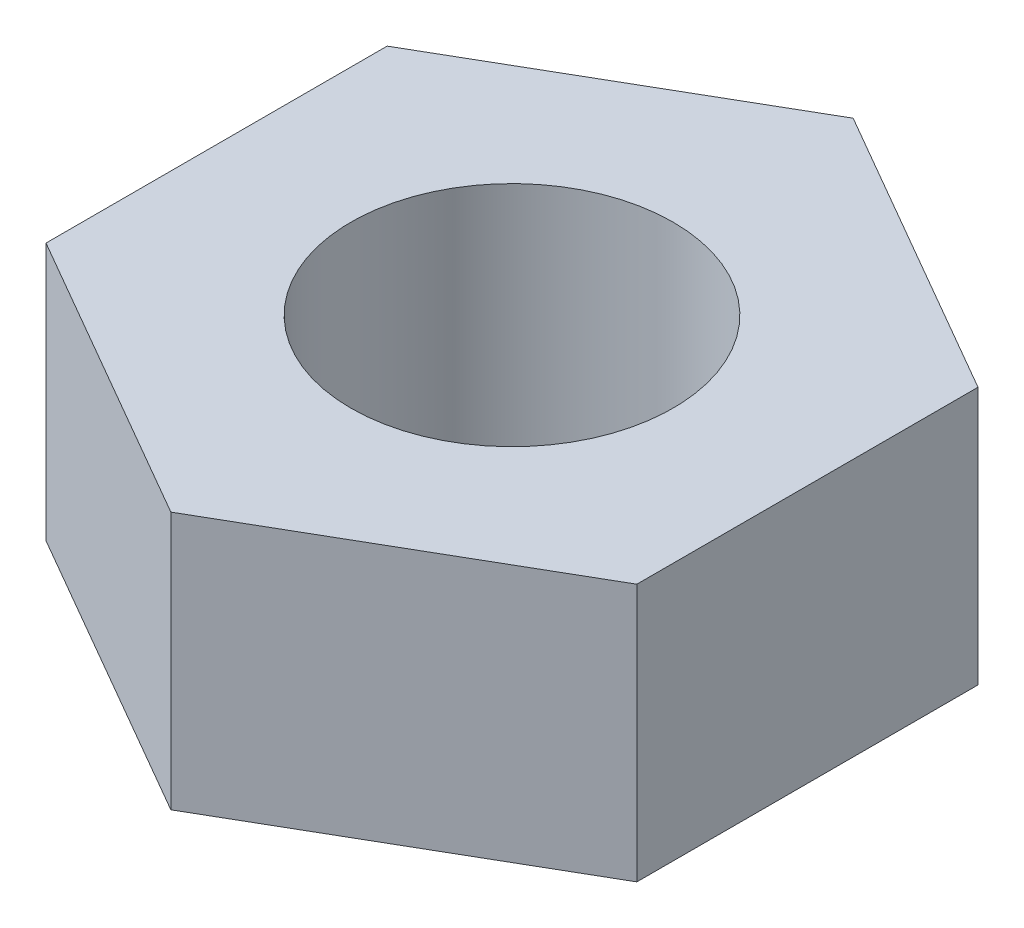
ISO-10303-21;
HEADER;
FILE_DESCRIPTION(('STEP AP214'),'2;1');
FILE_NAME('part.step','',(''),(''),'','','');
FILE_SCHEMA(('AUTOMOTIVE_DESIGN { 1 0 10303 214 1 1 1 1 }'));
ENDSEC;
DATA;
#1=APPLICATION_CONTEXT('core data for automotive mechanical design processes');
#2=APPLICATION_PROTOCOL_DEFINITION('international standard','automotive_design',2000,#1);
#3=PRODUCT_CONTEXT('',#1,'mechanical');
#4=PRODUCT('Part','Part','',(#3));
#5=PRODUCT_RELATED_PRODUCT_CATEGORY('part','',(#4));
#6=PRODUCT_DEFINITION_FORMATION('','',#4);
#7=PRODUCT_DEFINITION_CONTEXT('part definition',#1,'design');
#8=PRODUCT_DEFINITION('design','',#6,#7);
#9=PRODUCT_DEFINITION_SHAPE('','',#8);
#10=(LENGTH_UNIT() NAMED_UNIT(*) SI_UNIT(.MILLI.,.METRE.));
#11=(NAMED_UNIT(*) PLANE_ANGLE_UNIT() SI_UNIT($,.RADIAN.));
#12=(NAMED_UNIT(*) SI_UNIT($,.STERADIAN.) SOLID_ANGLE_UNIT());
#13=UNCERTAINTY_MEASURE_WITH_UNIT(LENGTH_MEASURE(1.E-05),#10,'distance_accuracy_value','');
#14=(GEOMETRIC_REPRESENTATION_CONTEXT(3) GLOBAL_UNCERTAINTY_ASSIGNED_CONTEXT((#13)) GLOBAL_UNIT_ASSIGNED_CONTEXT((#10,
#11,#12)) REPRESENTATION_CONTEXT('',''));
#15=CARTESIAN_POINT('',(0.,0.,0.));
#16=DIRECTION('',(0.,0.,1.));
#17=DIRECTION('',(1.,0.,0.));
#18=AXIS2_PLACEMENT_3D('',#15,#16,#17);
#19=CARTESIAN_POINT('',(0.,2.4,0.));
#20=DIRECTION('',(0.,1.,0.));
#21=DIRECTION('',(0.,0.,1.));
#22=AXIS2_PLACEMENT_3D('',#19,#20,#21);
#23=PLANE('',#22);
#24=DIRECTION('',(0.,0.,-1.));
#25=VECTOR('',#24,1.);
#26=CARTESIAN_POINT('',(2.75,2.4,1.58771324027147));
#27=LINE('',#26,#25);
#28=CARTESIAN_POINT('',(2.75,2.4,1.58771324027147));
#29=VERTEX_POINT('',#28);
#30=CARTESIAN_POINT('',(2.75,2.4,-1.58771324027147));
#31=VERTEX_POINT('',#30);
#32=EDGE_CURVE('E137',#29,#31,#27,.T.);
#33=ORIENTED_EDGE('',*,*,#32,.T.);
#34=DIRECTION('',(-0.866025403784439,0.,-0.5));
#35=VECTOR('',#34,1.);
#36=CARTESIAN_POINT('',(2.75,2.4,-1.58771324027147));
#37=LINE('',#36,#35);
#38=CARTESIAN_POINT('',(0.,2.4,-3.17542648054294));
#39=VERTEX_POINT('',#38);
#40=EDGE_CURVE('E95',#31,#39,#37,.T.);
#41=ORIENTED_EDGE('',*,*,#40,.T.);
#42=DIRECTION('',(-0.866025403784439,0.,0.5));
#43=VECTOR('',#42,1.);
#44=CARTESIAN_POINT('',(0.,2.4,-3.17542648054294));
#45=LINE('',#44,#43);
#46=CARTESIAN_POINT('',(-2.75,2.4,-1.58771324027147));
#47=VERTEX_POINT('',#46);
#48=EDGE_CURVE('E108',#39,#47,#45,.T.);
#49=ORIENTED_EDGE('',*,*,#48,.T.);
#50=DIRECTION('',(0.,0.,1.));
#51=VECTOR('',#50,1.);
#52=CARTESIAN_POINT('',(-2.75,2.4,-1.58771324027147));
#53=LINE('',#52,#51);
#54=CARTESIAN_POINT('',(-2.75,2.4,1.58771324027147));
#55=VERTEX_POINT('',#54);
#56=EDGE_CURVE('E102',#47,#55,#53,.T.);
#57=ORIENTED_EDGE('',*,*,#56,.T.);
#58=DIRECTION('',(0.866025403784439,0.,0.5));
#59=VECTOR('',#58,1.);
#60=CARTESIAN_POINT('',(-2.75,2.4,1.58771324027147));
#61=LINE('',#60,#59);
#62=CARTESIAN_POINT('',(0.,2.4,3.17542648054294));
#63=VERTEX_POINT('',#62);
#64=EDGE_CURVE('E106',#55,#63,#61,.T.);
#65=ORIENTED_EDGE('',*,*,#64,.T.);
#66=DIRECTION('',(0.866025403784439,0.,-0.5));
#67=VECTOR('',#66,1.);
#68=CARTESIAN_POINT('',(0.,2.4,3.17542648054294));
#69=LINE('',#68,#67);
#70=EDGE_CURVE('E58',#63,#29,#69,.T.);
#71=ORIENTED_EDGE('',*,*,#70,.T.);
#72=EDGE_LOOP('',(#33,#41,#49,#57,#65,#71));
#73=FACE_BOUND('',#72,.T.);
#74=CARTESIAN_POINT('',(0.,2.4,0.));
#75=DIRECTION('',(0.,1.,0.));
#76=DIRECTION('',(0.,0.,1.));
#77=AXIS2_PLACEMENT_3D('',#74,#75,#76);
#78=CIRCLE('',#77,1.5);
#79=CARTESIAN_POINT('',(0.,2.4,1.5));
#80=VERTEX_POINT('',#79);
#81=EDGE_CURVE('E130',#80,#80,#78,.T.);
#82=ORIENTED_EDGE('',*,*,#81,.F.);
#83=EDGE_LOOP('',(#82));
#84=FACE_BOUND('',#83,.T.);
#85=ADVANCED_FACE('F41',(#73,#84),#23,.T.);
#86=CARTESIAN_POINT('',(0.,0.,0.));
#87=DIRECTION('',(0.,1.,0.));
#88=DIRECTION('',(0.,0.,1.));
#89=AXIS2_PLACEMENT_3D('',#86,#87,#88);
#90=PLANE('',#89);
#91=DIRECTION('',(0.,0.,-1.));
#92=VECTOR('',#91,1.);
#93=CARTESIAN_POINT('',(2.75,0.,1.58771324027147));
#94=LINE('',#93,#92);
#95=CARTESIAN_POINT('',(2.75,0.,1.58771324027147));
#96=VERTEX_POINT('',#95);
#97=CARTESIAN_POINT('',(2.75,0.,-1.58771324027147));
#98=VERTEX_POINT('',#97);
#99=EDGE_CURVE('E126',#96,#98,#94,.T.);
#100=ORIENTED_EDGE('',*,*,#99,.F.);
#101=DIRECTION('',(0.866025403784439,0.,-0.5));
#102=VECTOR('',#101,1.);
#103=CARTESIAN_POINT('',(0.,0.,3.17542648054294));
#104=LINE('',#103,#102);
#105=CARTESIAN_POINT('',(0.,0.,3.17542648054294));
#106=VERTEX_POINT('',#105);
#107=EDGE_CURVE('E87',#106,#96,#104,.T.);
#108=ORIENTED_EDGE('',*,*,#107,.F.);
#109=DIRECTION('',(0.866025403784439,0.,0.5));
#110=VECTOR('',#109,1.);
#111=CARTESIAN_POINT('',(-2.75,0.,1.58771324027147));
#112=LINE('',#111,#110);
#113=CARTESIAN_POINT('',(-2.75,0.,1.58771324027147));
#114=VERTEX_POINT('',#113);
#115=EDGE_CURVE('E81',#114,#106,#112,.T.);
#116=ORIENTED_EDGE('',*,*,#115,.F.);
#117=DIRECTION('',(0.,0.,1.));
#118=VECTOR('',#117,1.);
#119=CARTESIAN_POINT('',(-2.75,0.,-1.58771324027147));
#120=LINE('',#119,#118);
#121=CARTESIAN_POINT('',(-2.75,0.,-1.58771324027147));
#122=VERTEX_POINT('',#121);
#123=EDGE_CURVE('E116',#122,#114,#120,.T.);
#124=ORIENTED_EDGE('',*,*,#123,.F.);
#125=DIRECTION('',(-0.866025403784439,0.,0.5));
#126=VECTOR('',#125,1.);
#127=CARTESIAN_POINT('',(0.,0.,-3.17542648054294));
#128=LINE('',#127,#126);
#129=CARTESIAN_POINT('',(0.,0.,-3.17542648054294));
#130=VERTEX_POINT('',#129);
#131=EDGE_CURVE('E132',#130,#122,#128,.T.);
#132=ORIENTED_EDGE('',*,*,#131,.F.);
#133=DIRECTION('',(-0.866025403784439,0.,-0.5));
#134=VECTOR('',#133,1.);
#135=CARTESIAN_POINT('',(2.75,0.,-1.58771324027147));
#136=LINE('',#135,#134);
#137=EDGE_CURVE('E129',#98,#130,#136,.T.);
#138=ORIENTED_EDGE('',*,*,#137,.F.);
#139=EDGE_LOOP('',(#100,#108,#116,#124,#132,#138));
#140=FACE_BOUND('',#139,.T.);
#141=CARTESIAN_POINT('',(0.,0.,0.));
#142=DIRECTION('',(0.,1.,0.));
#143=DIRECTION('',(0.,0.,1.));
#144=AXIS2_PLACEMENT_3D('',#141,#142,#143);
#145=CIRCLE('',#144,1.5);
#146=CARTESIAN_POINT('',(0.,0.,1.5));
#147=VERTEX_POINT('',#146);
#148=EDGE_CURVE('E230',#147,#147,#145,.T.);
#149=ORIENTED_EDGE('',*,*,#148,.T.);
#150=EDGE_LOOP('',(#149));
#151=FACE_BOUND('',#150,.T.);
#152=ADVANCED_FACE('F146',(#140,#151),#90,.F.);
#153=CARTESIAN_POINT('',(2.75,2.4,1.58771324027147));
#154=DIRECTION('',(-1.,0.,0.));
#155=DIRECTION('',(0.,0.,1.));
#156=AXIS2_PLACEMENT_3D('',#153,#154,#155);
#157=PLANE('',#156);
#158=ORIENTED_EDGE('',*,*,#99,.T.);
#159=DIRECTION('',(0.,-1.,0.));
#160=VECTOR('',#159,1.);
#161=CARTESIAN_POINT('',(2.75,2.4,-1.58771324027147));
#162=LINE('',#161,#160);
#163=EDGE_CURVE('E11',#31,#98,#162,.T.);
#164=ORIENTED_EDGE('',*,*,#163,.F.);
#165=ORIENTED_EDGE('',*,*,#32,.F.);
#166=DIRECTION('',(0.,-1.,0.));
#167=VECTOR('',#166,1.);
#168=CARTESIAN_POINT('',(2.75,2.4,1.58771324027147));
#169=LINE('',#168,#167);
#170=EDGE_CURVE('E122',#29,#96,#169,.T.);
#171=ORIENTED_EDGE('',*,*,#170,.T.);
#172=EDGE_LOOP('',(#158,#164,#165,#171));
#173=FACE_BOUND('',#172,.T.);
#174=ADVANCED_FACE('F43',(#173),#157,.F.);
#175=CARTESIAN_POINT('',(2.75,2.4,-1.58771324027147));
#176=DIRECTION('',(-0.5,0.,0.866025403784439));
#177=DIRECTION('',(0.866025403784439,0.,0.5));
#178=AXIS2_PLACEMENT_3D('',#175,#176,#177);
#179=PLANE('',#178);
#180=ORIENTED_EDGE('',*,*,#137,.T.);
#181=DIRECTION('',(0.,-1.,0.));
#182=VECTOR('',#181,1.);
#183=CARTESIAN_POINT('',(0.,2.4,-3.17542648054294));
#184=LINE('',#183,#182);
#185=EDGE_CURVE('E50',#39,#130,#184,.T.);
#186=ORIENTED_EDGE('',*,*,#185,.F.);
#187=ORIENTED_EDGE('',*,*,#40,.F.);
#188=ORIENTED_EDGE('',*,*,#163,.T.);
#189=EDGE_LOOP('',(#180,#186,#187,#188));
#190=FACE_BOUND('',#189,.T.);
#191=ADVANCED_FACE('F171',(#190),#179,.F.);
#192=CARTESIAN_POINT('',(0.,2.4,-3.17542648054294));
#193=DIRECTION('',(0.5,0.,0.866025403784439));
#194=DIRECTION('',(0.866025403784439,0.,-0.5));
#195=AXIS2_PLACEMENT_3D('',#192,#193,#194);
#196=PLANE('',#195);
#197=ORIENTED_EDGE('',*,*,#131,.T.);
#198=DIRECTION('',(0.,-1.,0.));
#199=VECTOR('',#198,1.);
#200=CARTESIAN_POINT('',(-2.75,2.4,-1.58771324027147));
#201=LINE('',#200,#199);
#202=EDGE_CURVE('E117',#47,#122,#201,.T.);
#203=ORIENTED_EDGE('',*,*,#202,.F.);
#204=ORIENTED_EDGE('',*,*,#48,.F.);
#205=ORIENTED_EDGE('',*,*,#185,.T.);
#206=EDGE_LOOP('',(#197,#203,#204,#205));
#207=FACE_BOUND('',#206,.T.);
#208=ADVANCED_FACE('F143',(#207),#196,.F.);
#209=CARTESIAN_POINT('',(-2.75,2.4,-1.58771324027147));
#210=DIRECTION('',(1.,0.,0.));
#211=DIRECTION('',(0.,0.,-1.));
#212=AXIS2_PLACEMENT_3D('',#209,#210,#211);
#213=PLANE('',#212);
#214=ORIENTED_EDGE('',*,*,#123,.T.);
#215=DIRECTION('',(0.,-1.,0.));
#216=VECTOR('',#215,1.);
#217=CARTESIAN_POINT('',(-2.75,2.4,1.58771324027147));
#218=LINE('',#217,#216);
#219=EDGE_CURVE('E113',#55,#114,#218,.T.);
#220=ORIENTED_EDGE('',*,*,#219,.F.);
#221=ORIENTED_EDGE('',*,*,#56,.F.);
#222=ORIENTED_EDGE('',*,*,#202,.T.);
#223=EDGE_LOOP('',(#214,#220,#221,#222));
#224=FACE_BOUND('',#223,.T.);
#225=ADVANCED_FACE('F114',(#224),#213,.F.);
#226=CARTESIAN_POINT('',(-2.75,2.4,1.58771324027147));
#227=DIRECTION('',(0.5,0.,-0.866025403784439));
#228=DIRECTION('',(-0.866025403784439,0.,-0.5));
#229=AXIS2_PLACEMENT_3D('',#226,#227,#228);
#230=PLANE('',#229);
#231=ORIENTED_EDGE('',*,*,#115,.T.);
#232=DIRECTION('',(0.,-1.,0.));
#233=VECTOR('',#232,1.);
#234=CARTESIAN_POINT('',(0.,2.4,3.17542648054294));
#235=LINE('',#234,#233);
#236=EDGE_CURVE('E118',#63,#106,#235,.T.);
#237=ORIENTED_EDGE('',*,*,#236,.F.);
#238=ORIENTED_EDGE('',*,*,#64,.F.);
#239=ORIENTED_EDGE('',*,*,#219,.T.);
#240=EDGE_LOOP('',(#231,#237,#238,#239));
#241=FACE_BOUND('',#240,.T.);
#242=ADVANCED_FACE('F120',(#241),#230,.F.);
#243=CARTESIAN_POINT('',(0.,2.4,3.17542648054294));
#244=DIRECTION('',(-0.5,0.,-0.866025403784439));
#245=DIRECTION('',(-0.866025403784439,0.,0.5));
#246=AXIS2_PLACEMENT_3D('',#243,#244,#245);
#247=PLANE('',#246);
#248=ORIENTED_EDGE('',*,*,#107,.T.);
#249=ORIENTED_EDGE('',*,*,#170,.F.);
#250=ORIENTED_EDGE('',*,*,#70,.F.);
#251=ORIENTED_EDGE('',*,*,#236,.T.);
#252=EDGE_LOOP('',(#248,#249,#250,#251));
#253=FACE_BOUND('',#252,.T.);
#254=ADVANCED_FACE('F151',(#253),#247,.F.);
#255=CARTESIAN_POINT('',(0.,2.4,0.));
#256=DIRECTION('',(0.,-1.,0.));
#257=DIRECTION('',(0.,0.,-1.));
#258=AXIS2_PLACEMENT_3D('',#255,#256,#257);
#259=CYLINDRICAL_SURFACE('',#258,1.5);
#260=ORIENTED_EDGE('',*,*,#81,.T.);
#261=EDGE_LOOP('',(#260));
#262=FACE_BOUND('',#261,.T.);
#263=ORIENTED_EDGE('',*,*,#148,.F.);
#264=EDGE_LOOP('',(#263));
#265=FACE_BOUND('',#264,.T.);
#266=ADVANCED_FACE('F153',(#262,#265),#259,.F.);
#267=CLOSED_SHELL('',(#85,#152,#174,#191,#208,#225,#242,#254,#266));
#268=MANIFOLD_SOLID_BREP('B2',#267);
#269=ADVANCED_BREP_SHAPE_REPRESENTATION('',(#18,#268),#14);
#270=SHAPE_DEFINITION_REPRESENTATION(#9,#269);
ENDSEC;
END-ISO-10303-21;
